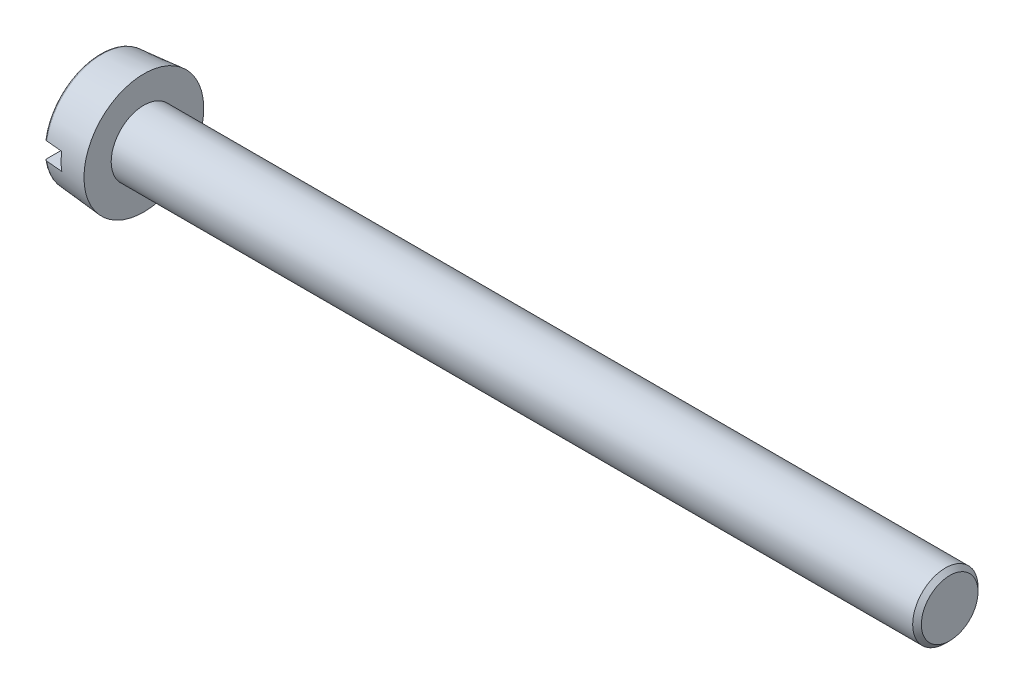
ISO-10303-21;
HEADER;
FILE_DESCRIPTION(('STEP AP214'),'2;1');
FILE_NAME('part.step','',(''),(''),'','','');
FILE_SCHEMA(('AUTOMOTIVE_DESIGN { 1 0 10303 214 1 1 1 1 }'));
ENDSEC;
DATA;
#1=APPLICATION_CONTEXT('core data for automotive mechanical design processes');
#2=APPLICATION_PROTOCOL_DEFINITION('international standard','automotive_design',2000,#1);
#3=PRODUCT_CONTEXT('',#1,'mechanical');
#4=PRODUCT('Part','Part','',(#3));
#5=PRODUCT_RELATED_PRODUCT_CATEGORY('part','',(#4));
#6=PRODUCT_DEFINITION_FORMATION('','',#4);
#7=PRODUCT_DEFINITION_CONTEXT('part definition',#1,'design');
#8=PRODUCT_DEFINITION('design','',#6,#7);
#9=PRODUCT_DEFINITION_SHAPE('','',#8);
#10=(LENGTH_UNIT() NAMED_UNIT(*) SI_UNIT(.MILLI.,.METRE.));
#11=(NAMED_UNIT(*) PLANE_ANGLE_UNIT() SI_UNIT($,.RADIAN.));
#12=(NAMED_UNIT(*) SI_UNIT($,.STERADIAN.) SOLID_ANGLE_UNIT());
#13=UNCERTAINTY_MEASURE_WITH_UNIT(LENGTH_MEASURE(1.E-05),#10,'distance_accuracy_value','');
#14=(GEOMETRIC_REPRESENTATION_CONTEXT(3) GLOBAL_UNCERTAINTY_ASSIGNED_CONTEXT((#13)) GLOBAL_UNIT_ASSIGNED_CONTEXT((#10,
#11,#12)) REPRESENTATION_CONTEXT('',''));
#15=CARTESIAN_POINT('',(0.,0.,0.));
#16=DIRECTION('',(0.,0.,1.));
#17=DIRECTION('',(1.,0.,0.));
#18=AXIS2_PLACEMENT_3D('',#15,#16,#17);
#19=CARTESIAN_POINT('',(0.,0.,0.));
#20=DIRECTION('',(-1.,0.,0.));
#21=DIRECTION('',(0.,0.,1.));
#22=AXIS2_PLACEMENT_3D('',#19,#20,#21);
#23=PLANE('',#22);
#24=DIRECTION('',(0.,0.,-1.));
#25=VECTOR('',#24,1.);
#26=CARTESIAN_POINT('',(0.,0.400000000000011,2.74999999999997));
#27=LINE('',#26,#25);
#28=CARTESIAN_POINT('',(0.,0.400000000000011,2.45096382768029));
#29=VERTEX_POINT('',#28);
#30=CARTESIAN_POINT('',(0.,0.400000000000011,-2.45096382768017));
#31=VERTEX_POINT('',#30);
#32=EDGE_CURVE('E116',#29,#31,#27,.T.);
#33=ORIENTED_EDGE('',*,*,#32,.F.);
#34=CARTESIAN_POINT('',(0.,0.,0.));
#35=DIRECTION('',(-1.,0.,0.));
#36=DIRECTION('',(0.,0.,1.));
#37=AXIS2_PLACEMENT_3D('',#34,#35,#36);
#38=CIRCLE('',#37,2.48338955554641);
#39=EDGE_CURVE('E120',#29,#31,#38,.T.);
#40=ORIENTED_EDGE('',*,*,#39,.T.);
#41=EDGE_LOOP('',(#33,#40));
#42=FACE_BOUND('',#41,.T.);
#43=ADVANCED_FACE('F44',(#42),#23,.T.);
#44=CARTESIAN_POINT('',(0.100000000000031,0.,0.));
#45=DIRECTION('',(-1.,0.,0.));
#46=DIRECTION('',(0.,0.,1.));
#47=AXIS2_PLACEMENT_3D('',#44,#45,#46);
#48=TOROIDAL_SURFACE('',#47,2.48338955554641,0.1);
#49=CARTESIAN_POINT('',(0.0289938380211852,0.400000000000011,-2.52228316549769));
#50=CARTESIAN_POINT('',(0.0329146400399064,0.400000000000011,-2.52628601737883));
#51=CARTESIAN_POINT('',(0.0371732059088188,0.400000000000012,-2.52996330795835));
#52=CARTESIAN_POINT('',(0.0462494374841756,0.400000000000012,-2.53655558833692));
#53=CARTESIAN_POINT('',(0.0510676904571189,0.400000000000011,-2.53946976679748));
#54=CARTESIAN_POINT('',(0.0611266188975279,0.400000000000011,-2.54444525866306));
#55=CARTESIAN_POINT('',(0.0663672780390925,0.400000000000012,-2.54650660501097));
#56=CARTESIAN_POINT('',(0.0771205298537789,0.400000000000012,-2.54971287140412));
#57=CARTESIAN_POINT('',(0.0826330564250672,0.400000000000011,-2.55085801306045));
#58=CARTESIAN_POINT('',(0.0937360108305032,0.400000000000011,-2.55219318080893));
#59=CARTESIAN_POINT('',(0.0993256947510282,0.400000000000012,-2.55238939597483));
#60=CARTESIAN_POINT('',(0.110458306622121,0.400000000000012,-2.55183747650021));
#61=CARTESIAN_POINT('',(0.116001234198397,0.400000000000011,-2.55108933430719));
#62=CARTESIAN_POINT('',(0.126865819783708,0.400000000000011,-2.54867516285263));
#63=CARTESIAN_POINT('',(0.132188090847113,0.400000000000012,-2.5470118897279));
#64=CARTESIAN_POINT('',(0.142479668135765,0.400000000000012,-2.54281935144472));
#65=CARTESIAN_POINT('',(0.14744897044457,0.400000000000011,-2.54029007667916));
#66=CARTESIAN_POINT('',(0.156919019556889,0.400000000000011,-2.53442699567862));
#67=CARTESIAN_POINT('',(0.161417530686898,0.400000000000012,-2.53108957986598));
#68=CARTESIAN_POINT('',(0.169797583318748,0.400000000000012,-2.52371398467406));
#69=CARTESIAN_POINT('',(0.173679096427571,0.400000000000011,-2.51967577306343));
#70=CARTESIAN_POINT('',(0.180758379631865,0.400000000000011,-2.51096934806695));
#71=CARTESIAN_POINT('',(0.183948691710412,0.400000000000012,-2.50629507144612));
#72=CARTESIAN_POINT('',(0.189510239570701,0.400000000000012,-2.49648236653709));
#73=CARTESIAN_POINT('',(0.19188142188351,0.400000000000011,-2.4913439079769));
#74=CARTESIAN_POINT('',(0.195767027940466,0.400000000000011,-2.48068220520694));
#75=CARTESIAN_POINT('',(0.197270760971889,0.400000000000012,-2.47515506403464));
#76=CARTESIAN_POINT('',(0.199338128353506,0.400000000000012,-2.4639276342002));
#77=CARTESIAN_POINT('',(0.19990170952622,0.400000000000011,-2.4582273357624));
#78=CARTESIAN_POINT('',(0.200075481339067,0.400000000000011,-2.44676112412243));
#79=CARTESIAN_POINT('',(0.199677113345972,0.400000000000012,-2.44099507954688));
#80=CARTESIAN_POINT('',(0.19791988966178,0.400000000000012,-2.42961109138143));
#81=CARTESIAN_POINT('',(0.196561010768149,0.400000000000011,-2.42399315137261));
#82=CARTESIAN_POINT('',(0.192915627153958,0.400000000000011,-2.41305590565847));
#83=CARTESIAN_POINT('',(0.190627555523962,0.400000000000012,-2.40773712175832));
#84=CARTESIAN_POINT('',(0.18518500091586,0.400000000000012,-2.39756279520369));
#85=CARTESIAN_POINT('',(0.182030540035591,0.400000000000011,-2.39270724073847));
#86=CARTESIAN_POINT('',(0.174965864483065,0.400000000000011,-2.38363467595378));
#87=CARTESIAN_POINT('',(0.171060998294442,0.400000000000012,-2.37941350258364));
#88=CARTESIAN_POINT('',(0.162589830789133,0.400000000000012,-2.37169707517615));
#89=CARTESIAN_POINT('',(0.158023574903154,0.400000000000011,-2.36820177131908));
#90=CARTESIAN_POINT('',(0.148421596079077,0.400000000000011,-2.36208459946198));
#91=CARTESIAN_POINT('',(0.143392636404652,0.400000000000012,-2.35945211619945));
#92=CARTESIAN_POINT('',(0.13296004269141,0.400000000000012,-2.35508144798973));
#93=CARTESIAN_POINT('',(0.127556438263748,0.400000000000011,-2.35334319245584));
#94=CARTESIAN_POINT('',(0.116602502745336,0.400000000000011,-2.35083201602086));
#95=CARTESIAN_POINT('',(0.111054942498252,0.400000000000012,-2.35004699968964));
#96=CARTESIAN_POINT('',(0.0999070705254327,0.400000000000012,-2.34942630654289));
#97=CARTESIAN_POINT('',(0.094306761361198,0.400000000000011,-2.34959058386431));
#98=CARTESIAN_POINT('',(0.0832511443149588,0.400000000000011,-2.35085902950957));
#99=CARTESIAN_POINT('',(0.0777951256899496,0.400000000000012,-2.35195701801452));
#100=CARTESIAN_POINT('',(0.0671440893672258,0.400000000000012,-2.35505088710292));
#101=CARTESIAN_POINT('',(0.0619490721184708,0.400000000000011,-2.35704676923083));
#102=CARTESIAN_POINT('',(0.0519500535749742,0.400000000000011,-2.36188301447904));
#103=CARTESIAN_POINT('',(0.0471472182076796,0.400000000000012,-2.36472578664258));
#104=CARTESIAN_POINT('',(0.0380802947551196,0.400000000000012,-2.37116917771984));
#105=CARTESIAN_POINT('',(0.0338162339656422,0.400000000000011,-2.37476983500547));
#106=CARTESIAN_POINT('',(0.0258978392798821,0.400000000000011,-2.38266730942149));
#107=CARTESIAN_POINT('',(0.0222505790304805,0.400000000000012,-2.38697121737474));
#108=CARTESIAN_POINT('',(0.0157188388686426,0.400000000000012,-2.39612333377565));
#109=CARTESIAN_POINT('',(0.0128344147286616,0.400000000000011,-2.40097158198421));
#110=CARTESIAN_POINT('',(0.00786953684594919,0.400000000000011,-2.41114518595597));
#111=CARTESIAN_POINT('',(0.0058004950444094,0.400000000000012,-2.41647611188954));
#112=CARTESIAN_POINT('',(0.00257668282243985,0.400000000000012,-2.42740741369928));
#113=CARTESIAN_POINT('',(0.00142193421230921,0.400000000000011,-2.43300779599989));
#114=CARTESIAN_POINT('',(4.98309082640217E-05,0.400000000000011,-2.44437919860998));
#115=CARTESIAN_POINT('',(-0.000158040154952279,0.400000000000012,-2.45015136490808));
#116=CARTESIAN_POINT('',(0.000395629680377693,0.400000000000012,-2.46165070249479));
#117=CARTESIAN_POINT('',(0.00115743264879782,0.400000000000011,-2.46737786119839));
#118=CARTESIAN_POINT('',(0.00363465605125818,0.400000000000011,-2.47863907342416));
#119=CARTESIAN_POINT('',(0.00535281370352839,0.400000000000012,-2.48417252398631));
#120=CARTESIAN_POINT('',(0.00969850669253555,0.400000000000012,-2.49486489969062));
#121=CARTESIAN_POINT('',(0.0123249394519217,0.400000000000011,-2.50002426979426));
#122=CARTESIAN_POINT('',(0.0173136943960089,0.400000000000012,-2.50805181152185));
#123=CARTESIAN_POINT('',(0.0194300826406492,0.400000000000012,-2.51107561025655));
#124=CARTESIAN_POINT('',(0.0239801784126097,0.400000000000012,-2.5168743150113));
#125=CARTESIAN_POINT('',(0.0264138847052323,0.400000000000012,-2.51964922199972));
#126=CARTESIAN_POINT('',(0.0289938380211852,0.400000000000011,-2.52228316549769));
#127=B_SPLINE_CURVE_WITH_KNOTS('',3,(#49,#50,#51,#52,#53,#54,#55,#56,#57,#58,#59,#60,#61,#62,
#63,#64,#65,#66,#67,#68,#69,#70,#71,#72,#73,#74,#75,#76,#77,#78,#79,#80,#81,#82,#83,#84,#85,#86,
#87,#88,#89,#90,#91,#92,#93,#94,#95,#96,#97,#98,#99,#100,#101,#102,#103,#104,#105,#106,#107,
#108,#109,#110,#111,#112,#113,#114,#115,#116,#117,#118,#119,#120,#121,#122,#123,#124,#125,#126),
.UNSPECIFIED.,.T.,.F.,(4,2,2,2,2,2,2,2,2,2,2,2,2,2,2,2,2,2,2,2,2,2,2,2,2,2,2,2,2,2,2,2,2,2,2,2,
2,2,4),(0.,0.0167962438770994,0.0336102736229378,0.0504236538217305,0.0672329659785584,
0.0839324954656991,0.100632158508168,0.117281799647198,0.133931625497112,0.150657236214867,
0.167383616389138,0.184282358747589,0.201182203967981,0.218286107817175,0.235390979075678,
0.252648595290797,0.269906628402924,0.287193885606199,0.30448070192737,0.321648593971774,
0.338815307316308,0.355762112546902,0.372707579860322,0.389435704571808,0.406163021106992,
0.422780481006354,0.439397969489126,0.456063186523251,0.472729247524428,0.489575093862918,
0.506422171494248,0.523497308438264,0.540572852694319,0.557819049576405,0.575069908508112,
0.592370397548935,0.609649958399164,0.620702210843313,0.631754420283975),.UNSPECIFIED.);
#128=CARTESIAN_POINT('',(0.0912844257253131,0.400000000000011,-2.55184945188158));
#129=VERTEX_POINT('',#128);
#130=EDGE_CURVE('E69',#31,#129,#127,.T.);
#131=ORIENTED_EDGE('',*,*,#130,.F.);
#132=ORIENTED_EDGE('',*,*,#39,.F.);
#133=CARTESIAN_POINT('',(0.0367676987021587,0.400000000000011,2.37243473528725));
#134=CARTESIAN_POINT('',(0.0410691072562369,0.400000000000011,2.36887462682045));
#135=CARTESIAN_POINT('',(0.0456712476146495,0.400000000000012,2.36567202074306));
#136=CARTESIAN_POINT('',(0.0553504912179037,0.400000000000012,2.36008032650185));
#137=CARTESIAN_POINT('',(0.0604280839551178,0.400000000000011,2.35769208875702));
#138=CARTESIAN_POINT('',(0.0709135886904103,0.400000000000011,2.35380489827381));
#139=CARTESIAN_POINT('',(0.0763214938192262,0.400000000000012,2.35230592704895));
#140=CARTESIAN_POINT('',(0.0873116719417452,0.400000000000012,2.35024450872374));
#141=CARTESIAN_POINT('',(0.0928939027986404,0.400000000000011,2.34968183706543));
#142=CARTESIAN_POINT('',(0.104036601297587,0.400000000000011,2.34951039508079));
#143=CARTESIAN_POINT('',(0.109596974662471,0.400000000000012,2.34989545024078));
#144=CARTESIAN_POINT('',(0.120573920357362,0.400000000000012,2.35159460899383));
#145=CARTESIAN_POINT('',(0.125990490202917,0.400000000000011,2.35290872862723));
#146=CARTESIAN_POINT('',(0.136522391247545,0.400000000000011,2.35642416504567));
#147=CARTESIAN_POINT('',(0.141637967615123,0.400000000000012,2.35862474798457));
#148=CARTESIAN_POINT('',(0.151431222534303,0.400000000000012,2.3638467445852));
#149=CARTESIAN_POINT('',(0.156108887376011,0.400000000000011,2.3668681839343));
#150=CARTESIAN_POINT('',(0.164936002938927,0.400000000000011,2.37367095440967));
#151=CARTESIAN_POINT('',(0.169080793893491,0.400000000000012,2.37745832978659));
#152=CARTESIAN_POINT('',(0.17668591075094,0.400000000000012,2.38566704388046));
#153=CARTESIAN_POINT('',(0.180146192360983,0.400000000000011,2.39008842359029));
#154=CARTESIAN_POINT('',(0.186332746435637,0.400000000000011,2.39950205527753));
#155=CARTESIAN_POINT('',(0.189048713902294,0.400000000000012,2.40450107962602));
#156=CARTESIAN_POINT('',(0.19361440989317,0.400000000000012,2.41488017557624));
#157=CARTESIAN_POINT('',(0.195464077650964,0.400000000000011,2.42026027387786));
#158=CARTESIAN_POINT('',(0.198266231334829,0.400000000000011,2.43131856240102));
#159=CARTESIAN_POINT('',(0.19920762017127,0.400000000000012,2.43699956654936));
#160=CARTESIAN_POINT('',(0.200129256919885,0.400000000000012,2.44843911280619));
#161=CARTESIAN_POINT('',(0.200109464431668,0.400000000000011,2.45419765816371));
#162=CARTESIAN_POINT('',(0.199105792419152,0.400000000000011,2.46566309979117));
#163=CARTESIAN_POINT('',(0.198116473192391,0.400000000000012,2.47136952123461));
#164=CARTESIAN_POINT('',(0.195191128966381,0.400000000000012,2.48253449565389));
#165=CARTESIAN_POINT('',(0.193255106776899,0.400000000000011,2.48799304936533));
#166=CARTESIAN_POINT('',(0.188494675278457,0.400000000000011,2.49848893070217));
#167=CARTESIAN_POINT('',(0.18567288095159,0.400000000000012,2.50352744366316));
#168=CARTESIAN_POINT('',(0.179215498557472,0.400000000000012,2.51305299197626));
#169=CARTESIAN_POINT('',(0.175579948629383,0.400000000000011,2.5175400531586));
#170=CARTESIAN_POINT('',(0.167635478825515,0.400000000000011,2.52578731588122));
#171=CARTESIAN_POINT('',(0.163333512373975,0.400000000000012,2.52955421420479));
#172=CARTESIAN_POINT('',(0.154151555490128,0.400000000000012,2.53630156216169));
#173=CARTESIAN_POINT('',(0.149271604711336,0.400000000000011,2.53928206570162));
#174=CARTESIAN_POINT('',(0.139136353071366,0.400000000000011,2.54433379308578));
#175=CARTESIAN_POINT('',(0.133886369113012,0.400000000000012,2.54641568563768));
#176=CARTESIAN_POINT('',(0.123109394747465,0.400000000000012,2.54965893225547));
#177=CARTESIAN_POINT('',(0.117582421034213,0.400000000000011,2.55082034172733));
#178=CARTESIAN_POINT('',(0.106464698916169,0.400000000000011,2.55218028189336));
#179=CARTESIAN_POINT('',(0.10087505459439,0.400000000000012,2.55238785185234));
#180=CARTESIAN_POINT('',(0.0897407847210153,0.400000000000012,2.5518584373795));
#181=CARTESIAN_POINT('',(0.0841961579349281,0.400000000000011,2.55112147893763));
#182=CARTESIAN_POINT('',(0.0733265657267187,0.400000000000011,2.5487291826396));
#183=CARTESIAN_POINT('',(0.0680009847337928,0.400000000000012,2.54707663871121));
#184=CARTESIAN_POINT('',(0.0577010526378489,0.400000000000012,2.54290481605141));
#185=CARTESIAN_POINT('',(0.0527267057044242,0.400000000000011,2.54038552703272));
#186=CARTESIAN_POINT('',(0.0432451955154411,0.400000000000011,2.53454156724992));
#187=CARTESIAN_POINT('',(0.0387402389480806,0.400000000000012,2.53121331773257));
#188=CARTESIAN_POINT('',(0.0303458654217854,0.400000000000012,2.52385482922164));
#189=CARTESIAN_POINT('',(0.0264564786943001,0.400000000000011,2.51982455577115));
#190=CARTESIAN_POINT('',(0.0193602742267246,0.400000000000011,2.51113277232452));
#191=CARTESIAN_POINT('',(0.0161608831052744,0.400000000000012,2.50646520000311));
#192=CARTESIAN_POINT('',(0.0105801862777093,0.400000000000012,2.49666430232761));
#193=CARTESIAN_POINT('',(0.00819893477650197,0.400000000000011,2.491530946142));
#194=CARTESIAN_POINT('',(0.00429230007910847,0.400000000000011,2.48087765570881));
#195=CARTESIAN_POINT('',(0.00277761888665923,0.400000000000012,2.4753537962001));
#196=CARTESIAN_POINT('',(0.000687995440599813,0.400000000000012,2.46413127035625));
#197=CARTESIAN_POINT('',(0.000113070892231067,0.400000000000011,2.45843260072969));
#198=CARTESIAN_POINT('',(-8.37002455856785E-05,0.400000000000011,2.44696818040158));
#199=CARTESIAN_POINT('',(0.000302941335796594,0.400000000000012,2.44120228266166));
#200=CARTESIAN_POINT('',(0.00203701001736218,0.400000000000012,2.429815082076));
#201=CARTESIAN_POINT('',(0.00338469494755209,0.400000000000011,2.42419381845228));
#202=CARTESIAN_POINT('',(0.00700896577895993,0.400000000000011,2.41324562761763));
#203=CARTESIAN_POINT('',(0.00928760515725427,0.400000000000012,2.40791938083125));
#204=CARTESIAN_POINT('',(0.0147114792186754,0.400000000000012,2.397733489781));
#205=CARTESIAN_POINT('',(0.0178556585516032,0.400000000000011,2.39287328693997));
#206=CARTESIAN_POINT('',(0.0236503626604935,0.400000000000012,2.38539954815907));
#207=CARTESIAN_POINT('',(0.0260726096208791,0.400000000000012,2.38260604033145));
#208=CARTESIAN_POINT('',(0.0312086078085778,0.400000000000012,2.37730112356));
#209=CARTESIAN_POINT('',(0.0339223576900242,0.400000000000012,2.37478971331385));
#210=CARTESIAN_POINT('',(0.0367676987021587,0.400000000000011,2.37243473528725));
#211=B_SPLINE_CURVE_WITH_KNOTS('',3,(#133,#134,#135,#136,#137,#138,#139,#140,#141,#142,#143,
#144,#145,#146,#147,#148,#149,#150,#151,#152,#153,#154,#155,#156,#157,#158,#159,#160,#161,#162,
#163,#164,#165,#166,#167,#168,#169,#170,#171,#172,#173,#174,#175,#176,#177,#178,#179,#180,#181,
#182,#183,#184,#185,#186,#187,#188,#189,#190,#191,#192,#193,#194,#195,#196,#197,#198,#199,#200,
#201,#202,#203,#204,#205,#206,#207,#208,#209,#210),.UNSPECIFIED.,.T.,.F.,(4,2,2,2,2,2,2,2,2,2,2,
2,2,2,2,2,2,2,2,2,2,2,2,2,2,2,2,2,2,2,2,2,2,2,2,2,2,2,4),(0.,0.0167374978406358,
0.0334924209723736,0.0502469957829308,0.0669975516707854,0.0836392656129547,0.100281266882431,
0.11690951952569,0.133538292583194,0.15030380318579,0.167070398286956,0.184058579715983,
0.201047952599283,0.218242362613177,0.235437495343459,0.252729660021828,0.270021773378246,
0.287263309496298,0.304504037705833,0.321575685446263,0.338646162637405,0.355507989950552,
0.372368802234782,0.389069495340305,0.405769728913954,0.4224192798493,0.439069028402694,
0.455793818907929,0.472519430535046,0.489416954805598,0.506315598386565,0.52341866668436,
0.540522057204365,0.557776961903043,0.575036497513246,0.592334311120969,0.609611126268898,
0.620682873655465,0.631754569926056),.UNSPECIFIED.);
#212=CARTESIAN_POINT('',(0.0912844257243833,0.400000000000011,2.55184945188525));
#213=VERTEX_POINT('',#212);
#214=EDGE_CURVE('E107',#213,#29,#211,.T.);
#215=ORIENTED_EDGE('',*,*,#214,.F.);
#216=CARTESIAN_POINT('',(0.0912844257252299,0.,0.));
#217=DIRECTION('',(-1.,0.,0.));
#218=DIRECTION('',(0.,0.,1.));
#219=AXIS2_PLACEMENT_3D('',#216,#217,#218);
#220=CIRCLE('',#219,2.58300902535558);
#221=EDGE_CURVE('E127',#129,#213,#220,.F.);
#222=ORIENTED_EDGE('',*,*,#221,.F.);
#223=EDGE_LOOP('',(#131,#132,#215,#222));
#224=FACE_BOUND('',#223,.T.);
#225=ADVANCED_FACE('F206',(#224),#48,.T.);
#226=CARTESIAN_POINT('',(-25.4,0.,0.));
#227=DIRECTION('',(-1.,0.,0.));
#228=DIRECTION('',(0.,0.,1.));
#229=AXIS2_PLACEMENT_3D('',#226,#227,#228);
#230=CYLINDRICAL_SURFACE('',#229,1.5);
#231=CARTESIAN_POINT('',(38.8,0.,0.));
#232=DIRECTION('',(1.,0.,0.));
#233=DIRECTION('',(0.,0.,-1.));
#234=AXIS2_PLACEMENT_3D('',#231,#232,#233);
#235=CIRCLE('',#234,1.5);
#236=CARTESIAN_POINT('',(38.8,0.,-1.5));
#237=VERTEX_POINT('',#236);
#238=EDGE_CURVE('E54',#237,#237,#235,.F.);
#239=ORIENTED_EDGE('',*,*,#238,.T.);
#240=EDGE_LOOP('',(#239));
#241=FACE_BOUND('',#240,.T.);
#242=CARTESIAN_POINT('',(2.,0.,0.));
#243=DIRECTION('',(-1.,0.,0.));
#244=DIRECTION('',(0.,0.,1.));
#245=AXIS2_PLACEMENT_3D('',#242,#243,#244);
#246=CIRCLE('',#245,1.5);
#247=CARTESIAN_POINT('',(2.,0.,1.5));
#248=VERTEX_POINT('',#247);
#249=EDGE_CURVE('E129',#248,#248,#246,.T.);
#250=ORIENTED_EDGE('',*,*,#249,.F.);
#251=EDGE_LOOP('',(#250));
#252=FACE_BOUND('',#251,.T.);
#253=ADVANCED_FACE('F203',(#241,#252),#230,.T.);
#254=CARTESIAN_POINT('',(39.,1.5,0.));
#255=DIRECTION('',(1.,0.,0.));
#256=DIRECTION('',(0.,0.,-1.));
#257=AXIS2_PLACEMENT_3D('',#254,#255,#256);
#258=PLANE('',#257);
#259=CARTESIAN_POINT('',(39.,0.,0.));
#260=DIRECTION('',(1.,0.,0.));
#261=DIRECTION('',(0.,0.,-1.));
#262=AXIS2_PLACEMENT_3D('',#259,#260,#261);
#263=CIRCLE('',#262,1.29999999999999);
#264=CARTESIAN_POINT('',(39.,0.,-1.29999999999999));
#265=VERTEX_POINT('',#264);
#266=EDGE_CURVE('E11',#265,#265,#263,.T.);
#267=ORIENTED_EDGE('',*,*,#266,.T.);
#268=EDGE_LOOP('',(#267));
#269=FACE_BOUND('',#268,.T.);
#270=ADVANCED_FACE('F205',(#269),#258,.T.);
#271=DIRECTION('',(0.,0.,1.));
#272=VECTOR('',#271,1.);
#273=CARTESIAN_POINT('',(0.,-0.400000000000011,-2.74999999999992));
#274=LINE('',#273,#272);
#275=CARTESIAN_POINT('',(0.,-0.400000000000011,-2.45096382768023));
#276=VERTEX_POINT('',#275);
#277=CARTESIAN_POINT('',(0.,-0.400000000000011,2.45096382768023));
#278=VERTEX_POINT('',#277);
#279=EDGE_CURVE('E61',#276,#278,#274,.T.);
#280=ORIENTED_EDGE('',*,*,#279,.F.);
#281=EDGE_CURVE('E113',#276,#278,#38,.T.);
#282=ORIENTED_EDGE('',*,*,#281,.T.);
#283=EDGE_LOOP('',(#280,#282));
#284=FACE_BOUND('',#283,.T.);
#285=ADVANCED_FACE('F112',(#284),#23,.T.);
#286=CARTESIAN_POINT('',(0.,0.,0.));
#287=DIRECTION('',(1.,0.,0.));
#288=DIRECTION('',(0.,0.,-1.));
#289=AXIS2_PLACEMENT_3D('',#286,#287,#288);
#290=CONICAL_SURFACE('',#289,2.57502267294815,0.0872664625997168);
#291=CARTESIAN_POINT('',(-4.36225986914578,0.400000000000011,-2.15659249783995));
#292=CARTESIAN_POINT('',(-3.02252879329929,0.400000000000011,-2.27578971400988));
#293=CARTESIAN_POINT('',(-1.68277158070832,0.400000000000011,-2.39469248552583));
#294=CARTESIAN_POINT('',(-0.0871929715729264,0.400000000000011,-2.53604555798389));
#295=CARTESIAN_POINT('',(0.168610376643317,0.400000000000011,-2.55869953286895));
#296=CARTESIAN_POINT('',(2.02000114161511,0.400000000000011,-2.72260692865387));
#297=CARTESIAN_POINT('',(3.61561248830963,0.400000000000011,-2.86359016848931));
#298=CARTESIAN_POINT('',(5.21123588736551,0.400000000000011,-3.00443640584802));
#299=B_SPLINE_CURVE_WITH_KNOTS('',3,(#291,#292,#293,#294,#295,#296,#297,#298),.UNSPECIFIED.,.F.,
.F.,(4,2,2,4),(0.,4.035069399239,4.80548292410982,9.61096578658466),.UNSPECIFIED.);
#300=CARTESIAN_POINT('',(0.850000000000087,0.400000000000011,-2.61901832187333));
#301=VERTEX_POINT('',#300);
#302=EDGE_CURVE('E191',#129,#301,#299,.T.);
#303=ORIENTED_EDGE('',*,*,#302,.F.);
#304=ORIENTED_EDGE('',*,*,#221,.T.);
#305=CARTESIAN_POINT('',(5.21123588736544,0.400000000000011,3.00443640584797));
#306=CARTESIAN_POINT('',(4.41342358696223,0.400000000000011,2.93401988873196));
#307=CARTESIAN_POINT('',(3.61561486907634,0.400000000000011,2.86356274948076));
#308=CARTESIAN_POINT('',(2.02000692465131,0.400000000000011,2.72254136292326));
#309=CARTESIAN_POINT('',(1.22220769811187,0.400000000000011,2.65197711562021));
#310=CARTESIAN_POINT('',(-0.373378996688625,0.400000000000012,2.51071564393345));
#311=CARTESIAN_POINT('',(-1.17116646494952,0.400000000000012,2.44001841954794));
#312=CARTESIAN_POINT('',(-2.76672581923322,0.400000000000012,2.298448092182));
#313=CARTESIAN_POINT('',(-3.56449770525556,0.400000000000012,2.22757498919618));
#314=CARTESIAN_POINT('',(-4.36225986914576,0.400000000000011,2.15659249784));
#315=B_SPLINE_CURVE_WITH_KNOTS('',3,(#305,#306,#307,#308,#309,#310,#311,#312,#313,#314),
.UNSPECIFIED.,.F.,.F.,(4,2,2,2,4),(0.,2.40274147318214,4.80548287330203,7.20822430613116,
9.61096581263779),.UNSPECIFIED.);
#316=CARTESIAN_POINT('',(0.850000000000004,0.400000000000011,2.61901832187333));
#317=VERTEX_POINT('',#316);
#318=EDGE_CURVE('E185',#317,#213,#315,.T.);
#319=ORIENTED_EDGE('',*,*,#318,.F.);
#320=CARTESIAN_POINT('',(0.850000000000017,0.,0.));
#321=DIRECTION('',(-1.,0.,0.));
#322=DIRECTION('',(0.,0.,1.));
#323=AXIS2_PLACEMENT_3D('',#320,#321,#322);
#324=CIRCLE('',#323,2.64938803694519);
#325=CARTESIAN_POINT('',(0.850000000000004,-0.400000000000011,2.61901832187333));
#326=VERTEX_POINT('',#325);
#327=EDGE_CURVE('E309',#317,#326,#324,.F.);
#328=ORIENTED_EDGE('',*,*,#327,.T.);
#329=CARTESIAN_POINT('',(-4.36225986914576,-0.400000000000039,2.15659249784006));
#330=CARTESIAN_POINT('',(-3.02252879329931,-0.400000000000018,2.27578971401009));
#331=CARTESIAN_POINT('',(-1.68277158070833,-0.400000000000012,2.39469248552597));
#332=CARTESIAN_POINT('',(-0.0871929715729443,-0.400000000000011,2.53604555798393));
#333=CARTESIAN_POINT('',(0.168610376643281,-0.400000000000011,2.55869953286897));
#334=CARTESIAN_POINT('',(2.02000114161505,-0.400000000000012,2.72260692865376));
#335=CARTESIAN_POINT('',(3.61561248830955,-0.400000000000018,2.8635901684891));
#336=CARTESIAN_POINT('',(5.21123588736544,-0.400000000000011,3.00443640584797));
#337=B_SPLINE_CURVE_WITH_KNOTS('',3,(#329,#330,#331,#332,#333,#334,#335,#336),.UNSPECIFIED.,.F.,
.F.,(4,2,2,4),(0.,4.03506939923898,4.80548292410975,9.61096578658456),.UNSPECIFIED.);
#338=CARTESIAN_POINT('',(0.0912844257241197,-0.400000000000011,2.55184945188158));
#339=VERTEX_POINT('',#338);
#340=EDGE_CURVE('E160',#339,#326,#337,.T.);
#341=ORIENTED_EDGE('',*,*,#340,.F.);
#342=CARTESIAN_POINT('',(0.0912844257452833,-0.400000000000011,-2.55184945199816));
#343=VERTEX_POINT('',#342);
#344=EDGE_CURVE('E133',#339,#343,#220,.F.);
#345=ORIENTED_EDGE('',*,*,#344,.T.);
#346=CARTESIAN_POINT('',(5.21123588736551,-0.400000000000011,-3.00443640584802));
#347=CARTESIAN_POINT('',(4.4134235869623,-0.400000000000012,-2.93401988873199));
#348=CARTESIAN_POINT('',(3.61561486907641,-0.400000000000012,-2.86356274948077));
#349=CARTESIAN_POINT('',(2.02000692465138,-0.400000000000012,-2.72254136292326));
#350=CARTESIAN_POINT('',(1.22220769811194,-0.400000000000012,-2.6519771156202));
#351=CARTESIAN_POINT('',(-0.373378996688567,-0.400000000000011,-2.51071564393345));
#352=CARTESIAN_POINT('',(-1.17116646494947,-0.400000000000011,-2.44001841954794));
#353=CARTESIAN_POINT('',(-2.7667258192332,-0.400000000000011,-2.298448092182));
#354=CARTESIAN_POINT('',(-3.56449770525555,-0.400000000000011,-2.22757498919618));
#355=CARTESIAN_POINT('',(-4.36225986914576,-0.400000000000011,-2.15659249784));
#356=B_SPLINE_CURVE_WITH_KNOTS('',3,(#346,#347,#348,#349,#350,#351,#352,#353,#354,#355),
.UNSPECIFIED.,.F.,.F.,(4,2,2,2,4),(0.,2.40274147318214,4.80548287330203,7.20822430613119,
9.61096581263786),.UNSPECIFIED.);
#357=CARTESIAN_POINT('',(0.850000000000087,-0.400000000000011,-2.61901832187333));
#358=VERTEX_POINT('',#357);
#359=EDGE_CURVE('E101',#358,#343,#356,.T.);
#360=ORIENTED_EDGE('',*,*,#359,.F.);
#361=EDGE_CURVE('E305',#358,#301,#324,.F.);
#362=ORIENTED_EDGE('',*,*,#361,.T.);
#363=EDGE_LOOP('',(#303,#304,#319,#328,#341,#345,#360,#362));
#364=FACE_BOUND('',#363,.T.);
#365=CARTESIAN_POINT('',(2.,0.,0.));
#366=DIRECTION('',(-1.,0.,0.));
#367=DIRECTION('',(0.,0.,1.));
#368=AXIS2_PLACEMENT_3D('',#365,#366,#367);
#369=CIRCLE('',#368,2.75);
#370=CARTESIAN_POINT('',(2.,0.,2.75));
#371=VERTEX_POINT('',#370);
#372=EDGE_CURVE('E121',#371,#371,#369,.T.);
#373=ORIENTED_EDGE('',*,*,#372,.T.);
#374=EDGE_LOOP('',(#373));
#375=FACE_BOUND('',#374,.T.);
#376=ADVANCED_FACE('F174',(#364,#375),#290,.T.);
#377=CARTESIAN_POINT('',(2.00000000000002,1.5,0.));
#378=DIRECTION('',(-1.,0.,0.));
#379=DIRECTION('',(0.,0.,1.));
#380=AXIS2_PLACEMENT_3D('',#377,#378,#379);
#381=PLANE('',#380);
#382=ORIENTED_EDGE('',*,*,#372,.F.);
#383=EDGE_LOOP('',(#382));
#384=FACE_BOUND('',#383,.T.);
#385=ORIENTED_EDGE('',*,*,#249,.T.);
#386=EDGE_LOOP('',(#385));
#387=FACE_BOUND('',#386,.T.);
#388=ADVANCED_FACE('F178',(#384,#387),#381,.F.);
#389=CARTESIAN_POINT('',(0.028993838021199,-0.400000000000011,-2.52228316549763));
#390=CARTESIAN_POINT('',(0.0250040691259608,-0.400000000000012,-2.51820918182999));
#391=CARTESIAN_POINT('',(0.0213583190112348,-0.400000000000011,-2.51379201367193));
#392=CARTESIAN_POINT('',(0.0148592785644333,-0.400000000000011,-2.50440306026761));
#393=CARTESIAN_POINT('',(0.0120070700796453,-0.400000000000011,-2.49943053069829));
#394=CARTESIAN_POINT('',(0.00717770347924872,-0.400000000000011,-2.48908271582266));
#395=CARTESIAN_POINT('',(0.00519971746696239,-0.400000000000011,-2.48370781723));
#396=CARTESIAN_POINT('',(0.00216717495670863,-0.400000000000011,-2.47270542437936));
#397=CARTESIAN_POINT('',(0.00111238322137506,-0.400000000000011,-2.46707799485274));
#398=CARTESIAN_POINT('',(-5.25582059244282E-05,-0.400000000000011,-2.45568286085497));
#399=CARTESIAN_POINT('',(-0.00015546782538669,-0.400000000000011,-2.44991441534208));
#400=CARTESIAN_POINT('',(0.00060449995904626,-0.400000000000011,-2.43844109806142));
#401=CARTESIAN_POINT('',(0.00146745336415709,-0.400000000000011,-2.43273623133216));
#402=CARTESIAN_POINT('',(0.00414151157260839,-0.400000000000011,-2.42152987250596));
#403=CARTESIAN_POINT('',(0.00595623339049824,-0.400000000000011,-2.41602924255962));
#404=CARTESIAN_POINT('',(0.0104876390060579,-0.400000000000011,-2.40541275972396));
#405=CARTESIAN_POINT('',(0.0132043100000701,-0.400000000000011,-2.40029690137386));
#406=CARTESIAN_POINT('',(0.0194512493610002,-0.400000000000011,-2.39062289289041));
#407=CARTESIAN_POINT('',(0.0229775960031725,-0.400000000000011,-2.38606221159141));
#408=CARTESIAN_POINT('',(0.0307542280705811,-0.400000000000011,-2.37760643337987));
#409=CARTESIAN_POINT('',(0.0350044686960854,-0.400000000000011,-2.37371129530861));
#410=CARTESIAN_POINT('',(0.0440555019555715,-0.400000000000011,-2.3667470396541));
#411=CARTESIAN_POINT('',(0.0488492409468929,-0.400000000000011,-2.36366875652184));
#412=CARTESIAN_POINT('',(0.0588909820215936,-0.400000000000011,-2.3583735233016));
#413=CARTESIAN_POINT('',(0.064138948144095,-0.400000000000011,-2.35615650510396));
#414=CARTESIAN_POINT('',(0.0748640783279025,-0.400000000000011,-2.35267719664889));
#415=CARTESIAN_POINT('',(0.0803372009928245,-0.400000000000011,-2.35140244386474));
#416=CARTESIAN_POINT('',(0.0914202264448089,-0.400000000000011,-2.34979886854022));
#417=CARTESIAN_POINT('',(0.0970301209943567,-0.400000000000011,-2.34946998917289));
#418=CARTESIAN_POINT('',(0.108175670502423,-0.400000000000011,-2.34976708273975));
#419=CARTESIAN_POINT('',(0.113711547505794,-0.400000000000011,-2.35038480500946));
#420=CARTESIAN_POINT('',(0.124600906547854,-0.400000000000011,-2.35254069219936));
#421=CARTESIAN_POINT('',(0.129954390579168,-0.400000000000011,-2.35407884706049));
#422=CARTESIAN_POINT('',(0.140330562478349,-0.400000000000011,-2.35802931008475));
#423=CARTESIAN_POINT('',(0.14535312232749,-0.400000000000011,-2.36044195422662));
#424=CARTESIAN_POINT('',(0.154926879209596,-0.400000000000011,-2.36606888937864));
#425=CARTESIAN_POINT('',(0.159478058010386,-0.400000000000011,-2.36928321137986));
#426=CARTESIAN_POINT('',(0.168025501299993,-0.400000000000011,-2.37645214423982));
#427=CARTESIAN_POINT('',(0.17201631985238,-0.400000000000011,-2.38041324620994));
#428=CARTESIAN_POINT('',(0.179287042308506,-0.400000000000011,-2.38894140410149));
#429=CARTESIAN_POINT('',(0.182566897622763,-0.400000000000011,-2.39350850140419));
#430=CARTESIAN_POINT('',(0.188369159015895,-0.400000000000011,-2.40318459258692));
#431=CARTESIAN_POINT('',(0.190880811711666,-0.400000000000011,-2.40830003507253));
#432=CARTESIAN_POINT('',(0.195020891957954,-0.400000000000011,-2.41887665144674));
#433=CARTESIAN_POINT('',(0.196649260076512,-0.400000000000011,-2.42433784857191));
#434=CARTESIAN_POINT('',(0.198994072160046,-0.400000000000011,-2.43551846416641));
#435=CARTESIAN_POINT('',(0.199699802934929,-0.400000000000011,-2.44124013143328));
#436=CARTESIAN_POINT('',(0.200145599532946,-0.400000000000011,-2.45272108096225));
#437=CARTESIAN_POINT('',(0.199885628830461,-0.400000000000011,-2.4584803646389));
#438=CARTESIAN_POINT('',(0.198402716236494,-0.400000000000011,-2.46990089334108));
#439=CARTESIAN_POINT('',(0.197175332540712,-0.400000000000011,-2.47556156274736));
#440=CARTESIAN_POINT('',(0.19378396481187,-0.400000000000011,-2.48659519893131));
#441=CARTESIAN_POINT('',(0.191619990295668,-0.400000000000011,-2.49196816863171));
#442=CARTESIAN_POINT('',(0.186423491809563,-0.400000000000011,-2.50224986574268));
#443=CARTESIAN_POINT('',(0.183394426113058,-0.400000000000011,-2.50716034009667));
#444=CARTESIAN_POINT('',(0.176546746863114,-0.400000000000011,-2.51639609907408));
#445=CARTESIAN_POINT('',(0.172728172126232,-0.400000000000011,-2.52072141244991));
#446=CARTESIAN_POINT('',(0.164451603414087,-0.400000000000011,-2.52861521808816));
#447=CARTESIAN_POINT('',(0.160000663078345,-0.400000000000011,-2.53219110480068));
#448=CARTESIAN_POINT('',(0.150555440028504,-0.400000000000011,-2.53853392400497));
#449=CARTESIAN_POINT('',(0.145561193801795,-0.400000000000011,-2.54130091077496));
#450=CARTESIAN_POINT('',(0.135236369590678,-0.400000000000011,-2.54591243640717));
#451=CARTESIAN_POINT('',(0.129910608026017,-0.400000000000011,-2.54776776094682));
#452=CARTESIAN_POINT('',(0.119021928101738,-0.400000000000011,-2.55054885934359));
#453=CARTESIAN_POINT('',(0.113459032919017,-0.400000000000011,-2.55147472382785));
#454=CARTESIAN_POINT('',(0.102307195571604,-0.400000000000011,-2.55236453620601));
#455=CARTESIAN_POINT('',(0.096718933055329,-0.400000000000011,-2.55233702605629));
#456=CARTESIAN_POINT('',(0.0856253047271807,-0.400000000000011,-2.55134185745124));
#457=CARTESIAN_POINT('',(0.080119958353324,-0.400000000000011,-2.55037398192559));
#458=CARTESIAN_POINT('',(0.0693593931696975,-0.400000000000011,-2.54752998768225));
#459=CARTESIAN_POINT('',(0.0641037847018307,-0.400000000000011,-2.54565533854206));
#460=CARTESIAN_POINT('',(0.0539843368990926,-0.400000000000011,-2.54105571590676));
#461=CARTESIAN_POINT('',(0.0491200334774774,-0.400000000000012,-2.53833176895425));
#462=CARTESIAN_POINT('',(0.0417210877997265,-0.400000000000011,-2.53333714733837));
#463=CARTESIAN_POINT('',(0.0390206414531979,-0.400000000000011,-2.5313073112389));
#464=CARTESIAN_POINT('',(0.0338378944269882,-0.400000000000011,-2.52698612266308));
#465=CARTESIAN_POINT('',(0.0313555927448854,-0.400000000000011,-2.52469477138857));
#466=CARTESIAN_POINT('',(0.028993838021199,-0.400000000000011,-2.52228316549763));
#467=B_SPLINE_CURVE_WITH_KNOTS('',3,(#389,#390,#391,#392,#393,#394,#395,#396,#397,#398,#399,
#400,#401,#402,#403,#404,#405,#406,#407,#408,#409,#410,#411,#412,#413,#414,#415,#416,#417,#418,
#419,#420,#421,#422,#423,#424,#425,#426,#427,#428,#429,#430,#431,#432,#433,#434,#435,#436,#437,
#438,#439,#440,#441,#442,#443,#444,#445,#446,#447,#448,#449,#450,#451,#452,#453,#454,#455,#456,
#457,#458,#459,#460,#461,#462,#463,#464,#465,#466),.UNSPECIFIED.,.T.,.F.,(4,2,2,2,2,2,2,2,2,2,2,
2,2,2,2,2,2,2,2,2,2,2,2,2,2,2,2,2,2,2,2,2,2,2,2,2,2,2,4),(0.,0.0170942392389201,
0.0342116703729478,0.0513128562267252,0.06840968329041,0.0856364438942365,0.102864560121754,
0.120158628073215,0.137452450536501,0.154664213002584,0.171874910668617,0.188883439323991,
0.205890622654316,0.222668631829294,0.239445632980379,0.256077233802145,0.272708652867013,
0.289346468507173,0.305984927428101,0.322775300606079,0.339566820929852,0.356583638258363,
0.373601600424428,0.390815461144298,0.40802997294872,0.425323987595626,0.442617826519228,
0.459843477026106,0.477068280827686,0.49411417043055,0.511158915969759,0.527996838794403,
0.544833119675452,0.561518591762506,0.578207916374921,0.594870283327553,0.611512588116964,
0.62163161677773,0.631750598936955),.UNSPECIFIED.);
#468=EDGE_CURVE('E97',#343,#276,#467,.T.);
#469=ORIENTED_EDGE('',*,*,#468,.F.);
#470=ORIENTED_EDGE('',*,*,#344,.F.);
#471=CARTESIAN_POINT('',(0.0367676987021726,-0.400000000000011,2.37243473528725));
#472=CARTESIAN_POINT('',(0.0323825993918151,-0.400000000000015,2.37606476664097));
#473=CARTESIAN_POINT('',(0.0283037127586696,-0.400000000000013,2.38007177408389));
#474=CARTESIAN_POINT('',(0.020875409723681,-0.400000000000011,2.38871904036564));
#475=CARTESIAN_POINT('',(0.0175270033246375,-0.400000000000011,2.39336016173577));
#476=CARTESIAN_POINT('',(0.0116570776320388,-0.400000000000012,2.40313270602574));
#477=CARTESIAN_POINT('',(0.00913472821971837,-0.400000000000012,2.4082636299945));
#478=CARTESIAN_POINT('',(0.00497968232769606,-0.400000000000012,2.41887190213895));
#479=CARTESIAN_POINT('',(0.00334675788140205,-0.400000000000011,2.42434916114418));
#480=CARTESIAN_POINT('',(0.00100169668541725,-0.400000000000011,2.43554641737225));
#481=CARTESIAN_POINT('',(0.000297555213016363,-0.400000000000012,2.44126809010384));
#482=CARTESIAN_POINT('',(-0.000145121662977194,-0.400000000000012,2.45274905375033));
#483=CARTESIAN_POINT('',(0.000116421789322123,-0.400000000000011,2.45850834769898));
#484=CARTESIAN_POINT('',(0.00160247308836718,-0.400000000000011,2.46992855294407));
#485=CARTESIAN_POINT('',(0.0028314104504915,-0.400000000000012,2.4755888889604));
#486=CARTESIAN_POINT('',(0.00622581243882318,-0.400000000000012,2.48662159442502));
#487=CARTESIAN_POINT('',(0.00839126662822492,-0.400000000000011,2.49199396708169));
#488=CARTESIAN_POINT('',(0.0135905931181292,-0.400000000000011,2.50227420499959));
#489=CARTESIAN_POINT('',(0.0166210040147719,-0.400000000000012,2.507183819987));
#490=CARTESIAN_POINT('',(0.0234711987480105,-0.400000000000012,2.51641762191269));
#491=CARTESIAN_POINT('',(0.0272909405744401,-0.400000000000011,2.520741839987));
#492=CARTESIAN_POINT('',(0.0355696248224798,-0.400000000000011,2.52863327794775));
#493=CARTESIAN_POINT('',(0.0400215149385056,-0.400000000000012,2.53220789499491));
#494=CARTESIAN_POINT('',(0.0494684030940075,-0.400000000000012,2.53854802988592));
#495=CARTESIAN_POINT('',(0.0544633641997777,-0.400000000000011,2.54131360270489));
#496=CARTESIAN_POINT('',(0.0647892630326936,-0.400000000000011,2.54592217430934));
#497=CARTESIAN_POINT('',(0.0701153800428107,-0.400000000000012,2.54777597641343));
#498=CARTESIAN_POINT('',(0.081004712838817,-0.400000000000012,2.55055407863818));
#499=CARTESIAN_POINT('',(0.0865679149638021,-0.400000000000011,2.55147843223863));
#500=CARTESIAN_POINT('',(0.0977207563531836,-0.400000000000011,2.55236521435313));
#501=CARTESIAN_POINT('',(0.103309726295558,-0.400000000000012,2.55233608070091));
#502=CARTESIAN_POINT('',(0.11440293789,-0.400000000000012,2.55133769001563));
#503=CARTESIAN_POINT('',(0.119907181471732,-0.400000000000011,2.55036845442592));
#504=CARTESIAN_POINT('',(0.130663236148922,-0.400000000000011,2.54752235629073));
#505=CARTESIAN_POINT('',(0.135915551335554,-0.400000000000012,2.54564739710647));
#506=CARTESIAN_POINT('',(0.146033240425047,-0.400000000000012,2.54104687692431));
#507=CARTESIAN_POINT('',(0.150898607454469,-0.400000000000011,2.53832130082096));
#508=CARTESIAN_POINT('',(0.160133532834321,-0.400000000000011,2.5320830563121));
#509=CARTESIAN_POINT('',(0.164500283568393,-0.400000000000012,2.52856623315181));
#510=CARTESIAN_POINT('',(0.172589200308672,-0.400000000000012,2.52085649868401));
#511=CARTESIAN_POINT('',(0.176311333654103,-0.400000000000011,2.51666355314024));
#512=CARTESIAN_POINT('',(0.183048642136839,-0.400000000000011,2.50767286712185));
#513=CARTESIAN_POINT('',(0.186055783056351,-0.400000000000012,2.50286910685158));
#514=CARTESIAN_POINT('',(0.191231971525051,-0.400000000000012,2.49282955053384));
#515=CARTESIAN_POINT('',(0.19340096484826,-0.400000000000011,2.48759372655954));
#516=CARTESIAN_POINT('',(0.196865823745483,-0.400000000000011,2.47677152916934));
#517=CARTESIAN_POINT('',(0.198150936463166,-0.400000000000012,2.47118171212466));
#518=CARTESIAN_POINT('',(0.199773012529551,-0.400000000000012,2.45986610107164));
#519=CARTESIAN_POINT('',(0.200109924006272,-0.400000000000011,2.45414029964146));
#520=CARTESIAN_POINT('',(0.199826178778738,-0.400000000000011,2.44266501865172));
#521=CARTESIAN_POINT('',(0.199197601251526,-0.400000000000012,2.43691573330962));
#522=CARTESIAN_POINT('',(0.19698500429823,-0.400000000000012,2.42560388351768));
#523=CARTESIAN_POINT('',(0.195400968047114,-0.400000000000011,2.42004132235776));
#524=CARTESIAN_POINT('',(0.191318078557107,-0.400000000000011,2.4092581706942));
#525=CARTESIAN_POINT('',(0.188818610794432,-0.400000000000012,2.40403781269139));
#526=CARTESIAN_POINT('',(0.182972137296755,-0.400000000000012,2.39409522397093));
#527=CARTESIAN_POINT('',(0.179625156644997,-0.400000000000011,2.38937297851686));
#528=CARTESIAN_POINT('',(0.172204734064942,-0.400000000000011,2.38060178429022));
#529=CARTESIAN_POINT('',(0.168137165616125,-0.400000000000012,2.37654786844744));
#530=CARTESIAN_POINT('',(0.159371199251692,-0.400000000000012,2.36919152820336));
#531=CARTESIAN_POINT('',(0.154672845537638,-0.400000000000011,2.3658890511895));
#532=CARTESIAN_POINT('',(0.144844694580828,-0.400000000000011,2.36017590811798));
#533=CARTESIAN_POINT('',(0.139721379552884,-0.400000000000012,2.35775409121261));
#534=CARTESIAN_POINT('',(0.129137638954485,-0.400000000000012,2.35381742239512));
#535=CARTESIAN_POINT('',(0.123677253113324,-0.400000000000012,2.35230246381926));
#536=CARTESIAN_POINT('',(0.112647488636252,-0.400000000000011,2.35024006877604));
#537=CARTESIAN_POINT('',(0.107080321826043,-0.400000000000011,2.34968078927394));
#538=CARTESIAN_POINT('',(0.0959300668187851,-0.400000000000013,2.34951053477203));
#539=CARTESIAN_POINT('',(0.0903469755002054,-0.400000000000014,2.34989976058667));
#540=CARTESIAN_POINT('',(0.0793550427648861,-0.400000000000009,2.35161001176194));
#541=CARTESIAN_POINT('',(0.0739454647455544,-0.400000000000002,2.35292632935928));
#542=CARTESIAN_POINT('',(0.0634276574620673,-0.400000000000021,2.35644465047498));
#543=CARTESIAN_POINT('',(0.0583190694664376,-0.400000000000047,2.3586455741575));
#544=CARTESIAN_POINT('',(0.0504757118332243,-0.400000000000035,2.36283119494621));
#545=CARTESIAN_POINT('',(0.0476002394747308,-0.400000000000018,2.36455800496422));
#546=CARTESIAN_POINT('',(0.0420370347664684,-0.400000000000006,2.36829123725297));
#547=CARTESIAN_POINT('',(0.0393493011404058,-0.400000000000009,2.37029765762256));
#548=CARTESIAN_POINT('',(0.0367676987021726,-0.400000000000011,2.37243473528725));
#549=B_SPLINE_CURVE_WITH_KNOTS('',3,(#471,#472,#473,#474,#475,#476,#477,#478,#479,#480,#481,
#482,#483,#484,#485,#486,#487,#488,#489,#490,#491,#492,#493,#494,#495,#496,#497,#498,#499,#500,
#501,#502,#503,#504,#505,#506,#507,#508,#509,#510,#511,#512,#513,#514,#515,#516,#517,#518,#519,
#520,#521,#522,#523,#524,#525,#526,#527,#528,#529,#530,#531,#532,#533,#534,#535,#536,#537,#538,
#539,#540,#541,#542,#543,#544,#545,#546,#547,#548),.UNSPECIFIED.,.T.,.F.,(4,2,2,2,2,2,2,2,2,2,2,
2,2,2,2,2,2,2,2,2,2,2,2,2,2,2,2,2,2,2,2,2,2,2,2,2,2,2,4),(0.,0.0170655093154662,
0.0341544668773469,0.0512261983791458,0.0682935522008359,0.0855068889550613,0.102721631346889,
0.120015658571096,0.137309493070789,0.154535068368674,0.171759727114372,0.188805453722696,
0.205850021792767,0.22268745243211,0.239523914202731,0.256211423242334,0.272898551655313,
0.289550763936971,0.306203271949238,0.322945350420558,0.339688276913336,0.356611280877593,
0.373535379533148,0.390661890265467,0.407789337896752,0.42505805059419,0.442327067391759,
0.459607698090326,0.476887817405957,0.494033075203852,0.511177132193668,0.528095859708601,
0.54501259686907,0.561718134648519,0.578427209577169,0.595052042079099,0.61165664203839,
0.621703543346079,0.631750376345834),.UNSPECIFIED.);
#550=EDGE_CURVE('E108',#278,#339,#549,.T.);
#551=ORIENTED_EDGE('',*,*,#550,.F.);
#552=ORIENTED_EDGE('',*,*,#281,.F.);
#553=EDGE_LOOP('',(#469,#470,#551,#552));
#554=FACE_BOUND('',#553,.T.);
#555=ADVANCED_FACE('F118',(#554),#48,.T.);
#556=CARTESIAN_POINT('',(0.850000000000004,0.400000000000011,2.74999999999997));
#557=DIRECTION('',(0.,1.,0.));
#558=DIRECTION('',(0.,0.,1.));
#559=AXIS2_PLACEMENT_3D('',#556,#557,#558);
#560=PLANE('',#559);
#561=ORIENTED_EDGE('',*,*,#302,.T.);
#562=DIRECTION('',(0.,0.,-1.));
#563=VECTOR('',#562,1.);
#564=CARTESIAN_POINT('',(0.850000000000004,0.400000000000011,2.74999999999997));
#565=LINE('',#564,#563);
#566=EDGE_CURVE('E115',#317,#301,#565,.T.);
#567=ORIENTED_EDGE('',*,*,#566,.F.);
#568=ORIENTED_EDGE('',*,*,#318,.T.);
#569=ORIENTED_EDGE('',*,*,#214,.T.);
#570=ORIENTED_EDGE('',*,*,#32,.T.);
#571=ORIENTED_EDGE('',*,*,#130,.T.);
#572=EDGE_LOOP('',(#561,#567,#568,#569,#570,#571));
#573=FACE_BOUND('',#572,.T.);
#574=ADVANCED_FACE('F152',(#573),#560,.F.);
#575=CARTESIAN_POINT('',(0.850000000000087,-0.400000000000011,-2.74999999999997));
#576=DIRECTION('',(0.,-1.,0.));
#577=DIRECTION('',(0.,0.,-1.));
#578=AXIS2_PLACEMENT_3D('',#575,#576,#577);
#579=PLANE('',#578);
#580=ORIENTED_EDGE('',*,*,#359,.T.);
#581=ORIENTED_EDGE('',*,*,#468,.T.);
#582=ORIENTED_EDGE('',*,*,#279,.T.);
#583=ORIENTED_EDGE('',*,*,#550,.T.);
#584=ORIENTED_EDGE('',*,*,#340,.T.);
#585=DIRECTION('',(0.,0.,1.));
#586=VECTOR('',#585,1.);
#587=CARTESIAN_POINT('',(0.850000000000087,-0.400000000000011,-2.74999999999997));
#588=LINE('',#587,#586);
#589=EDGE_CURVE('E167',#358,#326,#588,.T.);
#590=ORIENTED_EDGE('',*,*,#589,.F.);
#591=EDGE_LOOP('',(#580,#581,#582,#583,#584,#590));
#592=FACE_BOUND('',#591,.T.);
#593=ADVANCED_FACE('F98',(#592),#579,.F.);
#594=CARTESIAN_POINT('',(0.850000000000059,0.400000000000011,-2.74999999999997));
#595=DIRECTION('',(-1.,0.,0.));
#596=DIRECTION('',(0.,0.,1.));
#597=AXIS2_PLACEMENT_3D('',#594,#595,#596);
#598=PLANE('',#597);
#599=ORIENTED_EDGE('',*,*,#589,.T.);
#600=ORIENTED_EDGE('',*,*,#327,.F.);
#601=ORIENTED_EDGE('',*,*,#566,.T.);
#602=ORIENTED_EDGE('',*,*,#361,.F.);
#603=EDGE_LOOP('',(#599,#600,#601,#602));
#604=FACE_BOUND('',#603,.T.);
#605=ADVANCED_FACE('F151',(#604),#598,.T.);
#606=CARTESIAN_POINT('',(38.8,0.,0.));
#607=DIRECTION('',(-1.,0.,0.));
#608=DIRECTION('',(0.,0.,1.));
#609=AXIS2_PLACEMENT_3D('',#606,#607,#608);
#610=CONICAL_SURFACE('',#609,1.5,0.785398163397437);
#611=ORIENTED_EDGE('',*,*,#266,.F.);
#612=EDGE_LOOP('',(#611));
#613=FACE_BOUND('',#612,.T.);
#614=ORIENTED_EDGE('',*,*,#238,.F.);
#615=EDGE_LOOP('',(#614));
#616=FACE_BOUND('',#615,.T.);
#617=ADVANCED_FACE('F47',(#613,#616),#610,.T.);
#618=CLOSED_SHELL('',(#43,#225,#253,#270,#285,#376,#388,#555,#574,#593,#605,#617));
#619=MANIFOLD_SOLID_BREP('B2',#618);
#620=ADVANCED_BREP_SHAPE_REPRESENTATION('',(#18,#619),#14);
#621=SHAPE_DEFINITION_REPRESENTATION(#9,#620);
ENDSEC;
END-ISO-10303-21;
